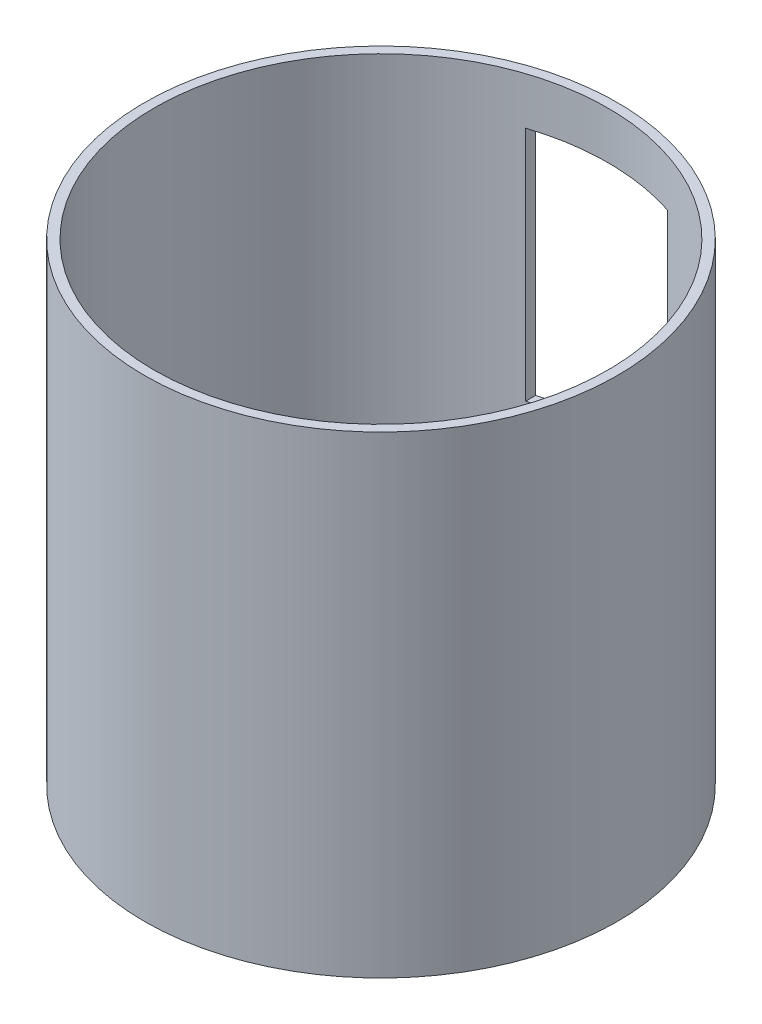
ISO-10303-21;
HEADER;
FILE_DESCRIPTION(('STEP AP214'),'2;1');
FILE_NAME('part.step','',(''),(''),'','','');
FILE_SCHEMA(('AUTOMOTIVE_DESIGN { 1 0 10303 214 1 1 1 1 }'));
ENDSEC;
DATA;
#1=APPLICATION_CONTEXT('core data for automotive mechanical design processes');
#2=APPLICATION_PROTOCOL_DEFINITION('international standard','automotive_design',2000,#1);
#3=PRODUCT_CONTEXT('',#1,'mechanical');
#4=PRODUCT('Part','Part','',(#3));
#5=PRODUCT_RELATED_PRODUCT_CATEGORY('part','',(#4));
#6=PRODUCT_DEFINITION_FORMATION('','',#4);
#7=PRODUCT_DEFINITION_CONTEXT('part definition',#1,'design');
#8=PRODUCT_DEFINITION('design','',#6,#7);
#9=PRODUCT_DEFINITION_SHAPE('','',#8);
#10=(LENGTH_UNIT() NAMED_UNIT(*) SI_UNIT(.MILLI.,.METRE.));
#11=(NAMED_UNIT(*) PLANE_ANGLE_UNIT() SI_UNIT($,.RADIAN.));
#12=(NAMED_UNIT(*) SI_UNIT($,.STERADIAN.) SOLID_ANGLE_UNIT());
#13=UNCERTAINTY_MEASURE_WITH_UNIT(LENGTH_MEASURE(1.E-05),#10,'distance_accuracy_value','');
#14=(GEOMETRIC_REPRESENTATION_CONTEXT(3) GLOBAL_UNCERTAINTY_ASSIGNED_CONTEXT((#13)) GLOBAL_UNIT_ASSIGNED_CONTEXT((#10,
#11,#12)) REPRESENTATION_CONTEXT('',''));
#15=CARTESIAN_POINT('',(0.,0.,0.));
#16=DIRECTION('',(0.,0.,1.));
#17=DIRECTION('',(1.,0.,0.));
#18=AXIS2_PLACEMENT_3D('',#15,#16,#17);
#19=CARTESIAN_POINT('',(0.,5000.,0.));
#20=DIRECTION('',(0.,-1.,0.));
#21=DIRECTION('',(0.,0.,-1.));
#22=AXIS2_PLACEMENT_3D('',#19,#20,#21);
#23=CYLINDRICAL_SURFACE('',#22,2500.);
#24=CARTESIAN_POINT('',(0.,0.,0.));
#25=DIRECTION('',(0.,1.,0.));
#26=DIRECTION('',(0.,0.,1.));
#27=AXIS2_PLACEMENT_3D('',#24,#25,#26);
#28=CIRCLE('',#27,2500.);
#29=CARTESIAN_POINT('',(0.,0.,2500.));
#30=VERTEX_POINT('',#29);
#31=EDGE_CURVE('E168',#30,#30,#28,.T.);
#32=ORIENTED_EDGE('',*,*,#31,.T.);
#33=EDGE_LOOP('',(#32));
#34=FACE_BOUND('',#33,.T.);
#35=CARTESIAN_POINT('',(0.,5000.,0.));
#36=DIRECTION('',(0.,1.,0.));
#37=DIRECTION('',(0.,0.,1.));
#38=AXIS2_PLACEMENT_3D('',#35,#36,#37);
#39=CIRCLE('',#38,2500.);
#40=CARTESIAN_POINT('',(0.,5000.,2500.));
#41=VERTEX_POINT('',#40);
#42=EDGE_CURVE('E173',#41,#41,#39,.T.);
#43=ORIENTED_EDGE('',*,*,#42,.F.);
#44=EDGE_LOOP('',(#43));
#45=FACE_BOUND('',#44,.T.);
#46=CARTESIAN_POINT('',(0.,2000.,0.));
#47=DIRECTION('',(0.,1.,0.));
#48=DIRECTION('',(0.,0.,1.));
#49=AXIS2_PLACEMENT_3D('',#46,#47,#48);
#50=CIRCLE('',#49,2500.);
#51=CARTESIAN_POINT('',(750.,2000.,-2384.84800354236));
#52=VERTEX_POINT('',#51);
#53=CARTESIAN_POINT('',(-750.,2000.,-2384.84800354236));
#54=VERTEX_POINT('',#53);
#55=EDGE_CURVE('E105',#52,#54,#50,.T.);
#56=ORIENTED_EDGE('',*,*,#55,.F.);
#57=DIRECTION('',(0.,-1.,0.));
#58=VECTOR('',#57,1.);
#59=CARTESIAN_POINT('',(750.,5000.,-2384.84800354236));
#60=LINE('',#59,#58);
#61=CARTESIAN_POINT('',(750.,4500.,-2384.84800354236));
#62=VERTEX_POINT('',#61);
#63=EDGE_CURVE('E93',#52,#62,#60,.F.);
#64=ORIENTED_EDGE('',*,*,#63,.T.);
#65=CARTESIAN_POINT('',(0.,4500.,0.));
#66=DIRECTION('',(0.,-1.,0.));
#67=DIRECTION('',(0.,0.,-1.));
#68=AXIS2_PLACEMENT_3D('',#65,#66,#67);
#69=CIRCLE('',#68,2500.);
#70=CARTESIAN_POINT('',(-750.,4500.,-2384.84800354236));
#71=VERTEX_POINT('',#70);
#72=EDGE_CURVE('E99',#71,#62,#69,.T.);
#73=ORIENTED_EDGE('',*,*,#72,.F.);
#74=DIRECTION('',(0.,-1.,0.));
#75=VECTOR('',#74,1.);
#76=CARTESIAN_POINT('',(-750.,5000.,-2384.84800354236));
#77=LINE('',#76,#75);
#78=EDGE_CURVE('E112',#54,#71,#77,.F.);
#79=ORIENTED_EDGE('',*,*,#78,.F.);
#80=EDGE_LOOP('',(#56,#64,#73,#79));
#81=FACE_BOUND('',#80,.T.);
#82=ADVANCED_FACE('F47',(#34,#45,#81),#23,.T.);
#83=CARTESIAN_POINT('',(0.,580.,0.));
#84=DIRECTION('',(0.,1.,0.));
#85=DIRECTION('',(0.,0.,1.));
#86=AXIS2_PLACEMENT_3D('',#83,#84,#85);
#87=CYLINDRICAL_SURFACE('',#86,2400.);
#88=CARTESIAN_POINT('',(0.,5000.,0.));
#89=DIRECTION('',(0.,1.,0.));
#90=DIRECTION('',(0.,0.,1.));
#91=AXIS2_PLACEMENT_3D('',#88,#89,#90);
#92=CIRCLE('',#91,2400.);
#93=CARTESIAN_POINT('',(0.,5000.,2400.));
#94=VERTEX_POINT('',#93);
#95=EDGE_CURVE('E114',#94,#94,#92,.T.);
#96=ORIENTED_EDGE('',*,*,#95,.T.);
#97=EDGE_LOOP('',(#96));
#98=FACE_BOUND('',#97,.T.);
#99=CARTESIAN_POINT('',(0.,580.,0.));
#100=DIRECTION('',(0.,1.,0.));
#101=DIRECTION('',(0.,0.,1.));
#102=AXIS2_PLACEMENT_3D('',#99,#100,#101);
#103=CIRCLE('',#102,2400.);
#104=CARTESIAN_POINT('',(0.,580.,2400.));
#105=VERTEX_POINT('',#104);
#106=EDGE_CURVE('E119',#105,#105,#103,.T.);
#107=ORIENTED_EDGE('',*,*,#106,.F.);
#108=EDGE_LOOP('',(#107));
#109=FACE_BOUND('',#108,.T.);
#110=CARTESIAN_POINT('',(0.,2000.,0.));
#111=DIRECTION('',(0.,1.,0.));
#112=DIRECTION('',(0.,0.,1.));
#113=AXIS2_PLACEMENT_3D('',#110,#111,#112);
#114=CIRCLE('',#113,2400.);
#115=CARTESIAN_POINT('',(-750.,2000.,-2279.8026230356));
#116=VERTEX_POINT('',#115);
#117=CARTESIAN_POINT('',(750.,2000.,-2279.8026230356));
#118=VERTEX_POINT('',#117);
#119=EDGE_CURVE('E12',#116,#118,#114,.F.);
#120=ORIENTED_EDGE('',*,*,#119,.F.);
#121=DIRECTION('',(0.,1.,0.));
#122=VECTOR('',#121,1.);
#123=CARTESIAN_POINT('',(-750.,580.,-2279.8026230356));
#124=LINE('',#123,#122);
#125=CARTESIAN_POINT('',(-750.,4500.,-2279.8026230356));
#126=VERTEX_POINT('',#125);
#127=EDGE_CURVE('E56',#126,#116,#124,.F.);
#128=ORIENTED_EDGE('',*,*,#127,.F.);
#129=CARTESIAN_POINT('',(0.,4500.,0.));
#130=DIRECTION('',(0.,-1.,0.));
#131=DIRECTION('',(0.,0.,-1.));
#132=AXIS2_PLACEMENT_3D('',#129,#130,#131);
#133=CIRCLE('',#132,2400.);
#134=CARTESIAN_POINT('',(750.,4500.,-2279.8026230356));
#135=VERTEX_POINT('',#134);
#136=EDGE_CURVE('E144',#135,#126,#133,.F.);
#137=ORIENTED_EDGE('',*,*,#136,.F.);
#138=DIRECTION('',(0.,1.,0.));
#139=VECTOR('',#138,1.);
#140=CARTESIAN_POINT('',(750.,580.,-2279.8026230356));
#141=LINE('',#140,#139);
#142=EDGE_CURVE('E176',#135,#118,#141,.F.);
#143=ORIENTED_EDGE('',*,*,#142,.T.);
#144=EDGE_LOOP('',(#120,#128,#137,#143));
#145=FACE_BOUND('',#144,.T.);
#146=ADVANCED_FACE('F185',(#98,#109,#145),#87,.F.);
#147=CARTESIAN_POINT('',(0.,5000.,0.));
#148=DIRECTION('',(0.,1.,0.));
#149=DIRECTION('',(0.,0.,1.));
#150=AXIS2_PLACEMENT_3D('',#147,#148,#149);
#151=PLANE('',#150);
#152=ORIENTED_EDGE('',*,*,#95,.F.);
#153=EDGE_LOOP('',(#152));
#154=FACE_BOUND('',#153,.T.);
#155=ORIENTED_EDGE('',*,*,#42,.T.);
#156=EDGE_LOOP('',(#155));
#157=FACE_BOUND('',#156,.T.);
#158=ADVANCED_FACE('F187',(#154,#157),#151,.T.);
#159=CARTESIAN_POINT('',(0.,0.,0.));
#160=DIRECTION('',(0.,1.,0.));
#161=DIRECTION('',(0.,0.,1.));
#162=AXIS2_PLACEMENT_3D('',#159,#160,#161);
#163=PLANE('',#162);
#164=CARTESIAN_POINT('',(0.,0.,0.));
#165=DIRECTION('',(0.,-1.,0.));
#166=DIRECTION('',(0.,0.,-1.));
#167=AXIS2_PLACEMENT_3D('',#164,#165,#166);
#168=CIRCLE('',#167,2000.);
#169=CARTESIAN_POINT('',(0.,0.,-2000.));
#170=VERTEX_POINT('',#169);
#171=EDGE_CURVE('E169',#170,#170,#168,.T.);
#172=ORIENTED_EDGE('',*,*,#171,.F.);
#173=EDGE_LOOP('',(#172));
#174=FACE_BOUND('',#173,.T.);
#175=ORIENTED_EDGE('',*,*,#31,.F.);
#176=EDGE_LOOP('',(#175));
#177=FACE_BOUND('',#176,.T.);
#178=ADVANCED_FACE('F194',(#174,#177),#163,.F.);
#179=CARTESIAN_POINT('',(0.,500.,0.));
#180=DIRECTION('',(0.,-1.,0.));
#181=DIRECTION('',(0.,0.,-1.));
#182=AXIS2_PLACEMENT_3D('',#179,#180,#181);
#183=CYLINDRICAL_SURFACE('',#182,2000.);
#184=CARTESIAN_POINT('',(0.,500.,0.));
#185=DIRECTION('',(0.,-1.,0.));
#186=DIRECTION('',(0.,0.,-1.));
#187=AXIS2_PLACEMENT_3D('',#184,#185,#186);
#188=CIRCLE('',#187,2000.);
#189=CARTESIAN_POINT('',(0.,500.,-2000.));
#190=VERTEX_POINT('',#189);
#191=EDGE_CURVE('E164',#190,#190,#188,.T.);
#192=ORIENTED_EDGE('',*,*,#191,.F.);
#193=EDGE_LOOP('',(#192));
#194=FACE_BOUND('',#193,.T.);
#195=ORIENTED_EDGE('',*,*,#171,.T.);
#196=EDGE_LOOP('',(#195));
#197=FACE_BOUND('',#196,.T.);
#198=ADVANCED_FACE('F211',(#194,#197),#183,.F.);
#199=CARTESIAN_POINT('',(0.,500.,0.));
#200=DIRECTION('',(0.,-1.,0.));
#201=DIRECTION('',(0.,0.,-1.));
#202=AXIS2_PLACEMENT_3D('',#199,#200,#201);
#203=PLANE('',#202);
#204=ORIENTED_EDGE('',*,*,#191,.T.);
#205=EDGE_LOOP('',(#204));
#206=FACE_BOUND('',#205,.T.);
#207=ADVANCED_FACE('F206',(#206),#203,.T.);
#208=CARTESIAN_POINT('',(0.,580.,0.));
#209=DIRECTION('',(0.,1.,0.));
#210=DIRECTION('',(0.,0.,1.));
#211=AXIS2_PLACEMENT_3D('',#208,#209,#210);
#212=PLANE('',#211);
#213=ORIENTED_EDGE('',*,*,#106,.T.);
#214=EDGE_LOOP('',(#213));
#215=FACE_BOUND('',#214,.T.);
#216=ADVANCED_FACE('F203',(#215),#212,.T.);
#217=CARTESIAN_POINT('',(0.,2000.,-4420.));
#218=DIRECTION('',(0.,1.,0.));
#219=DIRECTION('',(0.,0.,1.));
#220=AXIS2_PLACEMENT_3D('',#217,#218,#219);
#221=PLANE('',#220);
#222=ORIENTED_EDGE('',*,*,#55,.T.);
#223=DIRECTION('',(0.,0.,1.));
#224=VECTOR('',#223,1.);
#225=CARTESIAN_POINT('',(-750.,2000.,-4420.));
#226=LINE('',#225,#224);
#227=EDGE_CURVE('E100',#54,#116,#226,.T.);
#228=ORIENTED_EDGE('',*,*,#227,.T.);
#229=ORIENTED_EDGE('',*,*,#119,.T.);
#230=DIRECTION('',(0.,0.,1.));
#231=VECTOR('',#230,1.);
#232=CARTESIAN_POINT('',(750.,2000.,-4420.));
#233=LINE('',#232,#231);
#234=EDGE_CURVE('E72',#52,#118,#233,.T.);
#235=ORIENTED_EDGE('',*,*,#234,.F.);
#236=EDGE_LOOP('',(#222,#228,#229,#235));
#237=FACE_BOUND('',#236,.T.);
#238=ADVANCED_FACE('F103',(#237),#221,.T.);
#239=CARTESIAN_POINT('',(-750.,0.,-4420.));
#240=DIRECTION('',(1.,0.,0.));
#241=DIRECTION('',(0.,0.,-1.));
#242=AXIS2_PLACEMENT_3D('',#239,#240,#241);
#243=PLANE('',#242);
#244=ORIENTED_EDGE('',*,*,#78,.T.);
#245=DIRECTION('',(0.,0.,1.));
#246=VECTOR('',#245,1.);
#247=CARTESIAN_POINT('',(-750.,4500.,-4420.));
#248=LINE('',#247,#246);
#249=EDGE_CURVE('E143',#71,#126,#248,.T.);
#250=ORIENTED_EDGE('',*,*,#249,.T.);
#251=ORIENTED_EDGE('',*,*,#127,.T.);
#252=ORIENTED_EDGE('',*,*,#227,.F.);
#253=EDGE_LOOP('',(#244,#250,#251,#252));
#254=FACE_BOUND('',#253,.T.);
#255=ADVANCED_FACE('F183',(#254),#243,.T.);
#256=CARTESIAN_POINT('',(0.,4500.,-4420.));
#257=DIRECTION('',(0.,-1.,0.));
#258=DIRECTION('',(0.,0.,-1.));
#259=AXIS2_PLACEMENT_3D('',#256,#257,#258);
#260=PLANE('',#259);
#261=ORIENTED_EDGE('',*,*,#72,.T.);
#262=DIRECTION('',(0.,0.,1.));
#263=VECTOR('',#262,1.);
#264=CARTESIAN_POINT('',(750.,4500.,-4420.));
#265=LINE('',#264,#263);
#266=EDGE_CURVE('E66',#62,#135,#265,.T.);
#267=ORIENTED_EDGE('',*,*,#266,.T.);
#268=ORIENTED_EDGE('',*,*,#136,.T.);
#269=ORIENTED_EDGE('',*,*,#249,.F.);
#270=EDGE_LOOP('',(#261,#267,#268,#269));
#271=FACE_BOUND('',#270,.T.);
#272=ADVANCED_FACE('F140',(#271),#260,.T.);
#273=CARTESIAN_POINT('',(750.,0.,-4420.));
#274=DIRECTION('',(1.,0.,0.));
#275=DIRECTION('',(0.,0.,-1.));
#276=AXIS2_PLACEMENT_3D('',#273,#274,#275);
#277=PLANE('',#276);
#278=ORIENTED_EDGE('',*,*,#234,.T.);
#279=ORIENTED_EDGE('',*,*,#142,.F.);
#280=ORIENTED_EDGE('',*,*,#266,.F.);
#281=ORIENTED_EDGE('',*,*,#63,.F.);
#282=EDGE_LOOP('',(#278,#279,#280,#281));
#283=FACE_BOUND('',#282,.T.);
#284=ADVANCED_FACE('F94',(#283),#277,.F.);
#285=CLOSED_SHELL('',(#82,#146,#158,#178,#198,#207,#216,#238,#255,#272,#284));
#286=MANIFOLD_SOLID_BREP('B2',#285);
#287=ADVANCED_BREP_SHAPE_REPRESENTATION('',(#18,#286),#14);
#288=SHAPE_DEFINITION_REPRESENTATION(#9,#287);
ENDSEC;
END-ISO-10303-21;
